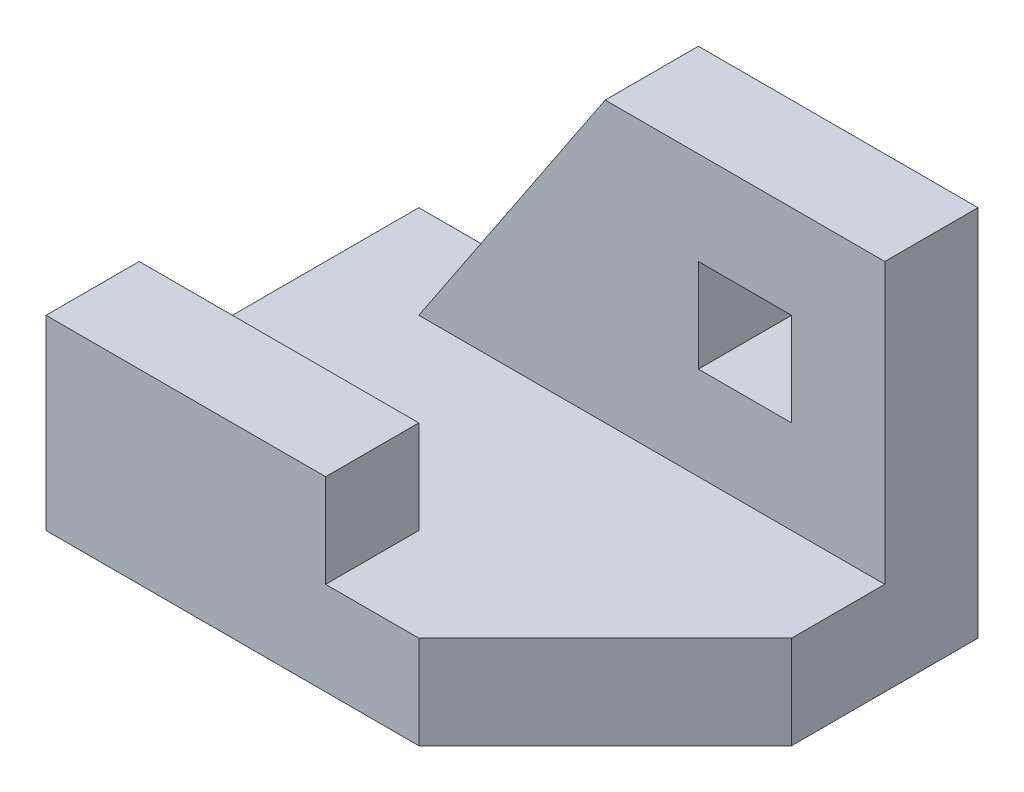
ISO-10303-21;
HEADER;
FILE_DESCRIPTION(('STEP AP214'),'2;1');
FILE_NAME('part.step','',(''),(''),'','','');
FILE_SCHEMA(('AUTOMOTIVE_DESIGN { 1 0 10303 214 1 1 1 1 }'));
ENDSEC;
DATA;
#1=APPLICATION_CONTEXT('core data for automotive mechanical design processes');
#2=APPLICATION_PROTOCOL_DEFINITION('international standard','automotive_design',2000,#1);
#3=PRODUCT_CONTEXT('',#1,'mechanical');
#4=PRODUCT('Part','Part','',(#3));
#5=PRODUCT_RELATED_PRODUCT_CATEGORY('part','',(#4));
#6=PRODUCT_DEFINITION_FORMATION('','',#4);
#7=PRODUCT_DEFINITION_CONTEXT('part definition',#1,'design');
#8=PRODUCT_DEFINITION('design','',#6,#7);
#9=PRODUCT_DEFINITION_SHAPE('','',#8);
#10=(LENGTH_UNIT() NAMED_UNIT(*) SI_UNIT(.MILLI.,.METRE.));
#11=(NAMED_UNIT(*) PLANE_ANGLE_UNIT() SI_UNIT($,.RADIAN.));
#12=(NAMED_UNIT(*) SI_UNIT($,.STERADIAN.) SOLID_ANGLE_UNIT());
#13=UNCERTAINTY_MEASURE_WITH_UNIT(LENGTH_MEASURE(1.E-05),#10,'distance_accuracy_value','');
#14=(GEOMETRIC_REPRESENTATION_CONTEXT(3) GLOBAL_UNCERTAINTY_ASSIGNED_CONTEXT((#13)) GLOBAL_UNIT_ASSIGNED_CONTEXT((#10,
#11,#12)) REPRESENTATION_CONTEXT('',''));
#15=CARTESIAN_POINT('',(0.,0.,0.));
#16=DIRECTION('',(0.,0.,1.));
#17=DIRECTION('',(1.,0.,0.));
#18=AXIS2_PLACEMENT_3D('',#15,#16,#17);
#19=CARTESIAN_POINT('',(0.,5.,0.));
#20=DIRECTION('',(0.,1.,0.));
#21=DIRECTION('',(0.,0.,1.));
#22=AXIS2_PLACEMENT_3D('',#19,#20,#21);
#23=PLANE('',#22);
#24=DIRECTION('',(-1.,0.,0.));
#25=VECTOR('',#24,1.);
#26=CARTESIAN_POINT('',(0.,5.,-5.));
#27=LINE('',#26,#25);
#28=CARTESIAN_POINT('',(15.,5.,-5.));
#29=VERTEX_POINT('',#28);
#30=CARTESIAN_POINT('',(0.,5.,-5.));
#31=VERTEX_POINT('',#30);
#32=EDGE_CURVE('E48',#29,#31,#27,.T.);
#33=ORIENTED_EDGE('',*,*,#32,.F.);
#34=DIRECTION('',(0.,0.,-1.));
#35=VECTOR('',#34,1.);
#36=CARTESIAN_POINT('',(15.,5.,0.));
#37=LINE('',#36,#35);
#38=CARTESIAN_POINT('',(15.,5.,0.));
#39=VERTEX_POINT('',#38);
#40=EDGE_CURVE('E166',#39,#29,#37,.T.);
#41=ORIENTED_EDGE('',*,*,#40,.F.);
#42=DIRECTION('',(1.,0.,0.));
#43=VECTOR('',#42,1.);
#44=CARTESIAN_POINT('',(0.,5.,0.));
#45=LINE('',#44,#43);
#46=CARTESIAN_POINT('',(20.,5.,0.));
#47=VERTEX_POINT('',#46);
#48=EDGE_CURVE('E247',#39,#47,#45,.T.);
#49=ORIENTED_EDGE('',*,*,#48,.T.);
#50=DIRECTION('',(-0.707106781186548,0.,0.707106781186548));
#51=VECTOR('',#50,1.);
#52=CARTESIAN_POINT('',(10.,5.,10.));
#53=LINE('',#52,#51);
#54=CARTESIAN_POINT('',(30.,5.,-10.));
#55=VERTEX_POINT('',#54);
#56=EDGE_CURVE('E237',#55,#47,#53,.T.);
#57=ORIENTED_EDGE('',*,*,#56,.F.);
#58=DIRECTION('',(0.,0.,1.));
#59=VECTOR('',#58,1.);
#60=CARTESIAN_POINT('',(30.,5.,0.));
#61=LINE('',#60,#59);
#62=CARTESIAN_POINT('',(30.,5.,-15.));
#63=VERTEX_POINT('',#62);
#64=EDGE_CURVE('E240',#63,#55,#61,.T.);
#65=ORIENTED_EDGE('',*,*,#64,.F.);
#66=DIRECTION('',(-1.,0.,0.));
#67=VECTOR('',#66,1.);
#68=CARTESIAN_POINT('',(5.,5.,-15.));
#69=LINE('',#68,#67);
#70=CARTESIAN_POINT('',(5.,5.,-15.));
#71=VERTEX_POINT('',#70);
#72=EDGE_CURVE('E218',#63,#71,#69,.T.);
#73=ORIENTED_EDGE('',*,*,#72,.T.);
#74=DIRECTION('',(0.,0.,-1.));
#75=VECTOR('',#74,1.);
#76=CARTESIAN_POINT('',(5.,5.,-15.));
#77=LINE('',#76,#75);
#78=CARTESIAN_POINT('',(5.,5.,-20.));
#79=VERTEX_POINT('',#78);
#80=EDGE_CURVE('E232',#71,#79,#77,.T.);
#81=ORIENTED_EDGE('',*,*,#80,.T.);
#82=DIRECTION('',(1.,0.,0.));
#83=VECTOR('',#82,1.);
#84=CARTESIAN_POINT('',(0.,5.,-20.));
#85=LINE('',#84,#83);
#86=CARTESIAN_POINT('',(0.,5.,-20.));
#87=VERTEX_POINT('',#86);
#88=EDGE_CURVE('E243',#87,#79,#85,.T.);
#89=ORIENTED_EDGE('',*,*,#88,.F.);
#90=DIRECTION('',(0.,0.,-1.));
#91=VECTOR('',#90,1.);
#92=CARTESIAN_POINT('',(0.,5.,0.));
#93=LINE('',#92,#91);
#94=EDGE_CURVE('E53',#31,#87,#93,.T.);
#95=ORIENTED_EDGE('',*,*,#94,.F.);
#96=EDGE_LOOP('',(#33,#41,#49,#57,#65,#73,#81,#89,#95));
#97=FACE_BOUND('',#96,.T.);
#98=ADVANCED_FACE('F33',(#97),#23,.T.);
#99=CARTESIAN_POINT('',(10.,5.,10.));
#100=DIRECTION('',(0.707106781186548,0.,0.707106781186548));
#101=DIRECTION('',(0.707106781186548,0.,-0.707106781186548));
#102=AXIS2_PLACEMENT_3D('',#99,#100,#101);
#103=PLANE('',#102);
#104=DIRECTION('',(-0.707106781186548,0.,0.707106781186548));
#105=VECTOR('',#104,1.);
#106=CARTESIAN_POINT('',(10.,0.,10.));
#107=LINE('',#106,#105);
#108=CARTESIAN_POINT('',(30.,0.,-10.));
#109=VERTEX_POINT('',#108);
#110=CARTESIAN_POINT('',(20.,0.,0.));
#111=VERTEX_POINT('',#110);
#112=EDGE_CURVE('E231',#109,#111,#107,.T.);
#113=ORIENTED_EDGE('',*,*,#112,.F.);
#114=DIRECTION('',(0.,-1.,0.));
#115=VECTOR('',#114,1.);
#116=CARTESIAN_POINT('',(30.,5.,-10.));
#117=LINE('',#116,#115);
#118=EDGE_CURVE('E11',#55,#109,#117,.T.);
#119=ORIENTED_EDGE('',*,*,#118,.F.);
#120=ORIENTED_EDGE('',*,*,#56,.T.);
#121=DIRECTION('',(0.,-1.,0.));
#122=VECTOR('',#121,1.);
#123=CARTESIAN_POINT('',(20.,5.,0.));
#124=LINE('',#123,#122);
#125=EDGE_CURVE('E150',#47,#111,#124,.T.);
#126=ORIENTED_EDGE('',*,*,#125,.T.);
#127=EDGE_LOOP('',(#113,#119,#120,#126));
#128=FACE_BOUND('',#127,.T.);
#129=ADVANCED_FACE('F35',(#128),#103,.T.);
#130=CARTESIAN_POINT('',(30.,5.,0.));
#131=DIRECTION('',(1.,0.,0.));
#132=DIRECTION('',(0.,0.,-1.));
#133=AXIS2_PLACEMENT_3D('',#130,#131,#132);
#134=PLANE('',#133);
#135=DIRECTION('',(0.,0.,1.));
#136=VECTOR('',#135,1.);
#137=CARTESIAN_POINT('',(30.,0.,0.));
#138=LINE('',#137,#136);
#139=CARTESIAN_POINT('',(30.,0.,-20.));
#140=VERTEX_POINT('',#139);
#141=EDGE_CURVE('E251',#140,#109,#138,.T.);
#142=ORIENTED_EDGE('',*,*,#141,.F.);
#143=DIRECTION('',(0.,-1.,0.));
#144=VECTOR('',#143,1.);
#145=CARTESIAN_POINT('',(30.,5.,-20.));
#146=LINE('',#145,#144);
#147=CARTESIAN_POINT('',(30.,20.,-20.));
#148=VERTEX_POINT('',#147);
#149=EDGE_CURVE('E41',#148,#140,#146,.T.);
#150=ORIENTED_EDGE('',*,*,#149,.F.);
#151=DIRECTION('',(0.,0.,-1.));
#152=VECTOR('',#151,1.);
#153=CARTESIAN_POINT('',(30.,20.,-15.));
#154=LINE('',#153,#152);
#155=CARTESIAN_POINT('',(30.,20.,-15.));
#156=VERTEX_POINT('',#155);
#157=EDGE_CURVE('E224',#156,#148,#154,.T.);
#158=ORIENTED_EDGE('',*,*,#157,.F.);
#159=DIRECTION('',(0.,-1.,0.));
#160=VECTOR('',#159,1.);
#161=CARTESIAN_POINT('',(30.,5.,-15.));
#162=LINE('',#161,#160);
#163=EDGE_CURVE('E214',#156,#63,#162,.T.);
#164=ORIENTED_EDGE('',*,*,#163,.T.);
#165=ORIENTED_EDGE('',*,*,#64,.T.);
#166=ORIENTED_EDGE('',*,*,#118,.T.);
#167=EDGE_LOOP('',(#142,#150,#158,#164,#165,#166));
#168=FACE_BOUND('',#167,.T.);
#169=ADVANCED_FACE('F268',(#168),#134,.T.);
#170=CARTESIAN_POINT('',(0.,5.,-20.));
#171=DIRECTION('',(0.,0.,-1.));
#172=DIRECTION('',(-1.,0.,0.));
#173=AXIS2_PLACEMENT_3D('',#170,#171,#172);
#174=PLANE('',#173);
#175=DIRECTION('',(1.,0.,0.));
#176=VECTOR('',#175,1.);
#177=CARTESIAN_POINT('',(0.,0.,-20.));
#178=LINE('',#177,#176);
#179=CARTESIAN_POINT('',(0.,0.,-20.));
#180=VERTEX_POINT('',#179);
#181=EDGE_CURVE('E254',#180,#140,#178,.T.);
#182=ORIENTED_EDGE('',*,*,#181,.F.);
#183=DIRECTION('',(0.,-1.,0.));
#184=VECTOR('',#183,1.);
#185=CARTESIAN_POINT('',(0.,5.,-20.));
#186=LINE('',#185,#184);
#187=EDGE_CURVE('E149',#87,#180,#186,.T.);
#188=ORIENTED_EDGE('',*,*,#187,.F.);
#189=ORIENTED_EDGE('',*,*,#88,.T.);
#190=DIRECTION('',(0.554700196225229,0.832050294337844,0.));
#191=VECTOR('',#190,1.);
#192=CARTESIAN_POINT('',(15.,20.,-20.));
#193=LINE('',#192,#191);
#194=CARTESIAN_POINT('',(15.,20.,-20.));
#195=VERTEX_POINT('',#194);
#196=EDGE_CURVE('E215',#79,#195,#193,.T.);
#197=ORIENTED_EDGE('',*,*,#196,.T.);
#198=DIRECTION('',(1.,0.,0.));
#199=VECTOR('',#198,1.);
#200=CARTESIAN_POINT('',(30.,20.,-20.));
#201=LINE('',#200,#199);
#202=EDGE_CURVE('E204',#195,#148,#201,.T.);
#203=ORIENTED_EDGE('',*,*,#202,.T.);
#204=ORIENTED_EDGE('',*,*,#149,.T.);
#205=EDGE_LOOP('',(#182,#188,#189,#197,#203,#204));
#206=FACE_BOUND('',#205,.T.);
#207=DIRECTION('',(0.,-1.,0.));
#208=VECTOR('',#207,1.);
#209=CARTESIAN_POINT('',(25.,15.,-20.));
#210=LINE('',#209,#208);
#211=CARTESIAN_POINT('',(25.,15.,-20.));
#212=VERTEX_POINT('',#211);
#213=CARTESIAN_POINT('',(25.,10.,-20.));
#214=VERTEX_POINT('',#213);
#215=EDGE_CURVE('E178',#212,#214,#210,.T.);
#216=ORIENTED_EDGE('',*,*,#215,.F.);
#217=DIRECTION('',(1.,0.,0.));
#218=VECTOR('',#217,1.);
#219=CARTESIAN_POINT('',(25.,15.,-20.));
#220=LINE('',#219,#218);
#221=CARTESIAN_POINT('',(20.,15.,-20.));
#222=VERTEX_POINT('',#221);
#223=EDGE_CURVE('E183',#222,#212,#220,.T.);
#224=ORIENTED_EDGE('',*,*,#223,.F.);
#225=DIRECTION('',(0.,1.,0.));
#226=VECTOR('',#225,1.);
#227=CARTESIAN_POINT('',(20.,15.,-20.));
#228=LINE('',#227,#226);
#229=CARTESIAN_POINT('',(20.,10.,-20.));
#230=VERTEX_POINT('',#229);
#231=EDGE_CURVE('E197',#230,#222,#228,.T.);
#232=ORIENTED_EDGE('',*,*,#231,.F.);
#233=DIRECTION('',(-1.,0.,0.));
#234=VECTOR('',#233,1.);
#235=CARTESIAN_POINT('',(25.,10.,-20.));
#236=LINE('',#235,#234);
#237=EDGE_CURVE('E194',#214,#230,#236,.T.);
#238=ORIENTED_EDGE('',*,*,#237,.F.);
#239=EDGE_LOOP('',(#216,#224,#232,#238));
#240=FACE_BOUND('',#239,.T.);
#241=ADVANCED_FACE('F263',(#206,#240),#174,.T.);
#242=CARTESIAN_POINT('',(0.,5.,0.));
#243=DIRECTION('',(-1.,0.,0.));
#244=DIRECTION('',(0.,0.,1.));
#245=AXIS2_PLACEMENT_3D('',#242,#243,#244);
#246=PLANE('',#245);
#247=DIRECTION('',(0.,0.,-1.));
#248=VECTOR('',#247,1.);
#249=CARTESIAN_POINT('',(0.,0.,0.));
#250=LINE('',#249,#248);
#251=CARTESIAN_POINT('',(0.,0.,0.));
#252=VERTEX_POINT('',#251);
#253=EDGE_CURVE('E145',#252,#180,#250,.T.);
#254=ORIENTED_EDGE('',*,*,#253,.F.);
#255=DIRECTION('',(0.,-1.,0.));
#256=VECTOR('',#255,1.);
#257=CARTESIAN_POINT('',(0.,5.,0.));
#258=LINE('',#257,#256);
#259=CARTESIAN_POINT('',(0.,10.,0.));
#260=VERTEX_POINT('',#259);
#261=EDGE_CURVE('E138',#260,#252,#258,.T.);
#262=ORIENTED_EDGE('',*,*,#261,.F.);
#263=DIRECTION('',(0.,0.,1.));
#264=VECTOR('',#263,1.);
#265=CARTESIAN_POINT('',(0.,10.,0.));
#266=LINE('',#265,#264);
#267=CARTESIAN_POINT('',(0.,10.,-5.));
#268=VERTEX_POINT('',#267);
#269=EDGE_CURVE('E143',#268,#260,#266,.T.);
#270=ORIENTED_EDGE('',*,*,#269,.F.);
#271=DIRECTION('',(0.,-1.,0.));
#272=VECTOR('',#271,1.);
#273=CARTESIAN_POINT('',(0.,10.,-5.));
#274=LINE('',#273,#272);
#275=EDGE_CURVE('E171',#268,#31,#274,.T.);
#276=ORIENTED_EDGE('',*,*,#275,.T.);
#277=ORIENTED_EDGE('',*,*,#94,.T.);
#278=ORIENTED_EDGE('',*,*,#187,.T.);
#279=EDGE_LOOP('',(#254,#262,#270,#276,#277,#278));
#280=FACE_BOUND('',#279,.T.);
#281=ADVANCED_FACE('F140',(#280),#246,.T.);
#282=CARTESIAN_POINT('',(0.,5.,0.));
#283=DIRECTION('',(0.,0.,-1.));
#284=DIRECTION('',(-1.,0.,0.));
#285=AXIS2_PLACEMENT_3D('',#282,#283,#284);
#286=PLANE('',#285);
#287=DIRECTION('',(1.,0.,0.));
#288=VECTOR('',#287,1.);
#289=CARTESIAN_POINT('',(0.,0.,0.));
#290=LINE('',#289,#288);
#291=EDGE_CURVE('E241',#252,#111,#290,.T.);
#292=ORIENTED_EDGE('',*,*,#291,.T.);
#293=ORIENTED_EDGE('',*,*,#125,.F.);
#294=ORIENTED_EDGE('',*,*,#48,.F.);
#295=DIRECTION('',(0.,-1.,0.));
#296=VECTOR('',#295,1.);
#297=CARTESIAN_POINT('',(15.,10.,0.));
#298=LINE('',#297,#296);
#299=CARTESIAN_POINT('',(15.,10.,0.));
#300=VERTEX_POINT('',#299);
#301=EDGE_CURVE('E156',#300,#39,#298,.T.);
#302=ORIENTED_EDGE('',*,*,#301,.F.);
#303=DIRECTION('',(1.,0.,0.));
#304=VECTOR('',#303,1.);
#305=CARTESIAN_POINT('',(0.,10.,0.));
#306=LINE('',#305,#304);
#307=EDGE_CURVE('E153',#260,#300,#306,.T.);
#308=ORIENTED_EDGE('',*,*,#307,.F.);
#309=ORIENTED_EDGE('',*,*,#261,.T.);
#310=EDGE_LOOP('',(#292,#293,#294,#302,#308,#309));
#311=FACE_BOUND('',#310,.T.);
#312=ADVANCED_FACE('F154',(#311),#286,.F.);
#313=CARTESIAN_POINT('',(0.,0.,0.));
#314=DIRECTION('',(0.,1.,0.));
#315=DIRECTION('',(0.,0.,1.));
#316=AXIS2_PLACEMENT_3D('',#313,#314,#315);
#317=PLANE('',#316);
#318=ORIENTED_EDGE('',*,*,#112,.T.);
#319=ORIENTED_EDGE('',*,*,#291,.F.);
#320=ORIENTED_EDGE('',*,*,#253,.T.);
#321=ORIENTED_EDGE('',*,*,#181,.T.);
#322=ORIENTED_EDGE('',*,*,#141,.T.);
#323=EDGE_LOOP('',(#318,#319,#320,#321,#322));
#324=FACE_BOUND('',#323,.T.);
#325=ADVANCED_FACE('F272',(#324),#317,.F.);
#326=CARTESIAN_POINT('',(30.,20.,-15.));
#327=DIRECTION('',(0.,1.,0.));
#328=DIRECTION('',(0.,0.,1.));
#329=AXIS2_PLACEMENT_3D('',#326,#327,#328);
#330=PLANE('',#329);
#331=ORIENTED_EDGE('',*,*,#202,.F.);
#332=DIRECTION('',(0.,0.,-1.));
#333=VECTOR('',#332,1.);
#334=CARTESIAN_POINT('',(15.,20.,-15.));
#335=LINE('',#334,#333);
#336=CARTESIAN_POINT('',(15.,20.,-15.));
#337=VERTEX_POINT('',#336);
#338=EDGE_CURVE('E229',#337,#195,#335,.T.);
#339=ORIENTED_EDGE('',*,*,#338,.F.);
#340=DIRECTION('',(1.,0.,0.));
#341=VECTOR('',#340,1.);
#342=CARTESIAN_POINT('',(30.,20.,-15.));
#343=LINE('',#342,#341);
#344=EDGE_CURVE('E211',#337,#156,#343,.T.);
#345=ORIENTED_EDGE('',*,*,#344,.T.);
#346=ORIENTED_EDGE('',*,*,#157,.T.);
#347=EDGE_LOOP('',(#331,#339,#345,#346));
#348=FACE_BOUND('',#347,.T.);
#349=ADVANCED_FACE('F290',(#348),#330,.T.);
#350=CARTESIAN_POINT('',(15.,20.,-15.));
#351=DIRECTION('',(-0.832050294337844,0.554700196225229,0.));
#352=DIRECTION('',(-0.554700196225229,-0.832050294337844,0.));
#353=AXIS2_PLACEMENT_3D('',#350,#351,#352);
#354=PLANE('',#353);
#355=ORIENTED_EDGE('',*,*,#196,.F.);
#356=ORIENTED_EDGE('',*,*,#80,.F.);
#357=DIRECTION('',(0.554700196225229,0.832050294337844,0.));
#358=VECTOR('',#357,1.);
#359=CARTESIAN_POINT('',(15.,20.,-15.));
#360=LINE('',#359,#358);
#361=EDGE_CURVE('E221',#71,#337,#360,.T.);
#362=ORIENTED_EDGE('',*,*,#361,.T.);
#363=ORIENTED_EDGE('',*,*,#338,.T.);
#364=EDGE_LOOP('',(#355,#356,#362,#363));
#365=FACE_BOUND('',#364,.T.);
#366=ADVANCED_FACE('F284',(#365),#354,.T.);
#367=CARTESIAN_POINT('',(0.,0.,-15.));
#368=DIRECTION('',(0.,0.,-1.));
#369=DIRECTION('',(-1.,0.,0.));
#370=AXIS2_PLACEMENT_3D('',#367,#368,#369);
#371=PLANE('',#370);
#372=DIRECTION('',(1.,0.,0.));
#373=VECTOR('',#372,1.);
#374=CARTESIAN_POINT('',(25.,15.,-15.));
#375=LINE('',#374,#373);
#376=CARTESIAN_POINT('',(20.,15.,-15.));
#377=VERTEX_POINT('',#376);
#378=CARTESIAN_POINT('',(25.,15.,-15.));
#379=VERTEX_POINT('',#378);
#380=EDGE_CURVE('E189',#377,#379,#375,.T.);
#381=ORIENTED_EDGE('',*,*,#380,.T.);
#382=DIRECTION('',(0.,-1.,0.));
#383=VECTOR('',#382,1.);
#384=CARTESIAN_POINT('',(25.,15.,-15.));
#385=LINE('',#384,#383);
#386=CARTESIAN_POINT('',(25.,10.,-15.));
#387=VERTEX_POINT('',#386);
#388=EDGE_CURVE('E179',#379,#387,#385,.T.);
#389=ORIENTED_EDGE('',*,*,#388,.T.);
#390=DIRECTION('',(-1.,0.,0.));
#391=VECTOR('',#390,1.);
#392=CARTESIAN_POINT('',(25.,10.,-15.));
#393=LINE('',#392,#391);
#394=CARTESIAN_POINT('',(20.,10.,-15.));
#395=VERTEX_POINT('',#394);
#396=EDGE_CURVE('E182',#387,#395,#393,.T.);
#397=ORIENTED_EDGE('',*,*,#396,.T.);
#398=DIRECTION('',(0.,1.,0.));
#399=VECTOR('',#398,1.);
#400=CARTESIAN_POINT('',(20.,15.,-15.));
#401=LINE('',#400,#399);
#402=EDGE_CURVE('E186',#395,#377,#401,.T.);
#403=ORIENTED_EDGE('',*,*,#402,.T.);
#404=EDGE_LOOP('',(#381,#389,#397,#403));
#405=FACE_BOUND('',#404,.T.);
#406=ORIENTED_EDGE('',*,*,#344,.F.);
#407=ORIENTED_EDGE('',*,*,#361,.F.);
#408=ORIENTED_EDGE('',*,*,#72,.F.);
#409=ORIENTED_EDGE('',*,*,#163,.F.);
#410=EDGE_LOOP('',(#406,#407,#408,#409));
#411=FACE_BOUND('',#410,.T.);
#412=ADVANCED_FACE('F287',(#405,#411),#371,.F.);
#413=CARTESIAN_POINT('',(25.,15.,-15.));
#414=DIRECTION('',(1.,0.,0.));
#415=DIRECTION('',(0.,0.,-1.));
#416=AXIS2_PLACEMENT_3D('',#413,#414,#415);
#417=PLANE('',#416);
#418=ORIENTED_EDGE('',*,*,#215,.T.);
#419=DIRECTION('',(0.,0.,-1.));
#420=VECTOR('',#419,1.);
#421=CARTESIAN_POINT('',(25.,10.,-15.));
#422=LINE('',#421,#420);
#423=EDGE_CURVE('E192',#387,#214,#422,.T.);
#424=ORIENTED_EDGE('',*,*,#423,.F.);
#425=ORIENTED_EDGE('',*,*,#388,.F.);
#426=DIRECTION('',(0.,0.,-1.));
#427=VECTOR('',#426,1.);
#428=CARTESIAN_POINT('',(25.,15.,-15.));
#429=LINE('',#428,#427);
#430=EDGE_CURVE('E202',#379,#212,#429,.T.);
#431=ORIENTED_EDGE('',*,*,#430,.T.);
#432=EDGE_LOOP('',(#418,#424,#425,#431));
#433=FACE_BOUND('',#432,.T.);
#434=ADVANCED_FACE('F415',(#433),#417,.F.);
#435=CARTESIAN_POINT('',(25.,15.,-15.));
#436=DIRECTION('',(0.,1.,0.));
#437=DIRECTION('',(0.,0.,1.));
#438=AXIS2_PLACEMENT_3D('',#435,#436,#437);
#439=PLANE('',#438);
#440=ORIENTED_EDGE('',*,*,#223,.T.);
#441=ORIENTED_EDGE('',*,*,#430,.F.);
#442=ORIENTED_EDGE('',*,*,#380,.F.);
#443=DIRECTION('',(0.,0.,-1.));
#444=VECTOR('',#443,1.);
#445=CARTESIAN_POINT('',(20.,15.,-15.));
#446=LINE('',#445,#444);
#447=EDGE_CURVE('E205',#377,#222,#446,.T.);
#448=ORIENTED_EDGE('',*,*,#447,.T.);
#449=EDGE_LOOP('',(#440,#441,#442,#448));
#450=FACE_BOUND('',#449,.T.);
#451=ADVANCED_FACE('F407',(#450),#439,.F.);
#452=CARTESIAN_POINT('',(20.,15.,-15.));
#453=DIRECTION('',(-1.,0.,0.));
#454=DIRECTION('',(0.,0.,1.));
#455=AXIS2_PLACEMENT_3D('',#452,#453,#454);
#456=PLANE('',#455);
#457=ORIENTED_EDGE('',*,*,#231,.T.);
#458=ORIENTED_EDGE('',*,*,#447,.F.);
#459=ORIENTED_EDGE('',*,*,#402,.F.);
#460=DIRECTION('',(0.,0.,-1.));
#461=VECTOR('',#460,1.);
#462=CARTESIAN_POINT('',(20.,10.,-15.));
#463=LINE('',#462,#461);
#464=EDGE_CURVE('E207',#395,#230,#463,.T.);
#465=ORIENTED_EDGE('',*,*,#464,.T.);
#466=EDGE_LOOP('',(#457,#458,#459,#465));
#467=FACE_BOUND('',#466,.T.);
#468=ADVANCED_FACE('F399',(#467),#456,.F.);
#469=CARTESIAN_POINT('',(25.,10.,-15.));
#470=DIRECTION('',(0.,-1.,0.));
#471=DIRECTION('',(0.,0.,-1.));
#472=AXIS2_PLACEMENT_3D('',#469,#470,#471);
#473=PLANE('',#472);
#474=ORIENTED_EDGE('',*,*,#237,.T.);
#475=ORIENTED_EDGE('',*,*,#464,.F.);
#476=ORIENTED_EDGE('',*,*,#396,.F.);
#477=ORIENTED_EDGE('',*,*,#423,.T.);
#478=EDGE_LOOP('',(#474,#475,#476,#477));
#479=FACE_BOUND('',#478,.T.);
#480=ADVANCED_FACE('F376',(#479),#473,.F.);
#481=CARTESIAN_POINT('',(15.,10.,0.));
#482=DIRECTION('',(-1.,0.,0.));
#483=DIRECTION('',(0.,0.,1.));
#484=AXIS2_PLACEMENT_3D('',#481,#482,#483);
#485=PLANE('',#484);
#486=ORIENTED_EDGE('',*,*,#40,.T.);
#487=DIRECTION('',(0.,-1.,0.));
#488=VECTOR('',#487,1.);
#489=CARTESIAN_POINT('',(15.,10.,-5.));
#490=LINE('',#489,#488);
#491=CARTESIAN_POINT('',(15.,10.,-5.));
#492=VERTEX_POINT('',#491);
#493=EDGE_CURVE('E174',#492,#29,#490,.T.);
#494=ORIENTED_EDGE('',*,*,#493,.F.);
#495=DIRECTION('',(0.,0.,-1.));
#496=VECTOR('',#495,1.);
#497=CARTESIAN_POINT('',(15.,10.,0.));
#498=LINE('',#497,#496);
#499=EDGE_CURVE('E159',#300,#492,#498,.T.);
#500=ORIENTED_EDGE('',*,*,#499,.F.);
#501=ORIENTED_EDGE('',*,*,#301,.T.);
#502=EDGE_LOOP('',(#486,#494,#500,#501));
#503=FACE_BOUND('',#502,.T.);
#504=ADVANCED_FACE('F279',(#503),#485,.F.);
#505=CARTESIAN_POINT('',(0.,10.,-5.));
#506=DIRECTION('',(0.,0.,1.));
#507=DIRECTION('',(1.,0.,0.));
#508=AXIS2_PLACEMENT_3D('',#505,#506,#507);
#509=PLANE('',#508);
#510=ORIENTED_EDGE('',*,*,#32,.T.);
#511=ORIENTED_EDGE('',*,*,#275,.F.);
#512=DIRECTION('',(-1.,0.,0.));
#513=VECTOR('',#512,1.);
#514=CARTESIAN_POINT('',(0.,10.,-5.));
#515=LINE('',#514,#513);
#516=EDGE_CURVE('E163',#492,#268,#515,.T.);
#517=ORIENTED_EDGE('',*,*,#516,.F.);
#518=ORIENTED_EDGE('',*,*,#493,.T.);
#519=EDGE_LOOP('',(#510,#511,#517,#518));
#520=FACE_BOUND('',#519,.T.);
#521=ADVANCED_FACE('F281',(#520),#509,.F.);
#522=CARTESIAN_POINT('',(0.,10.,0.));
#523=DIRECTION('',(0.,-1.,0.));
#524=DIRECTION('',(0.,0.,-1.));
#525=AXIS2_PLACEMENT_3D('',#522,#523,#524);
#526=PLANE('',#525);
#527=ORIENTED_EDGE('',*,*,#269,.T.);
#528=ORIENTED_EDGE('',*,*,#307,.T.);
#529=ORIENTED_EDGE('',*,*,#499,.T.);
#530=ORIENTED_EDGE('',*,*,#516,.T.);
#531=EDGE_LOOP('',(#527,#528,#529,#530));
#532=FACE_BOUND('',#531,.T.);
#533=ADVANCED_FACE('F161',(#532),#526,.F.);
#534=CLOSED_SHELL('',(#98,#129,#169,#241,#281,#312,#325,#349,#366,#412,#434,#451,#468,#480,#504,
#521,#533));
#535=MANIFOLD_SOLID_BREP('B2',#534);
#536=ADVANCED_BREP_SHAPE_REPRESENTATION('',(#18,#535),#14);
#537=SHAPE_DEFINITION_REPRESENTATION(#9,#536);
ENDSEC;
END-ISO-10303-21;
